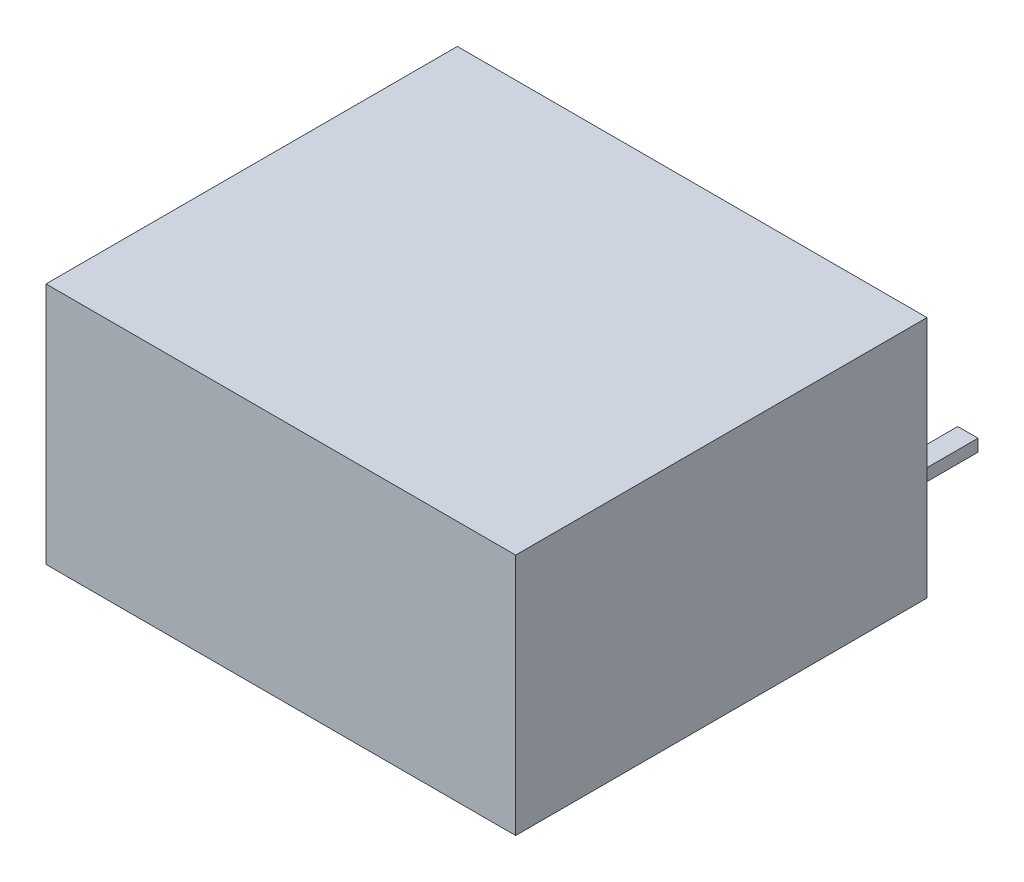
ISO-10303-21;
HEADER;
FILE_DESCRIPTION(('STEP AP214'),'2;1');
FILE_NAME('part.step','',(''),(''),'','','');
FILE_SCHEMA(('AUTOMOTIVE_DESIGN { 1 0 10303 214 1 1 1 1 }'));
ENDSEC;
DATA;
#1=APPLICATION_CONTEXT('core data for automotive mechanical design processes');
#2=APPLICATION_PROTOCOL_DEFINITION('international standard','automotive_design',2000,#1);
#3=PRODUCT_CONTEXT('',#1,'mechanical');
#4=PRODUCT('Part','Part','',(#3));
#5=PRODUCT_RELATED_PRODUCT_CATEGORY('part','',(#4));
#6=PRODUCT_DEFINITION_FORMATION('','',#4);
#7=PRODUCT_DEFINITION_CONTEXT('part definition',#1,'design');
#8=PRODUCT_DEFINITION('design','',#6,#7);
#9=PRODUCT_DEFINITION_SHAPE('','',#8);
#10=(LENGTH_UNIT() NAMED_UNIT(*) SI_UNIT(.MILLI.,.METRE.));
#11=(NAMED_UNIT(*) PLANE_ANGLE_UNIT() SI_UNIT($,.RADIAN.));
#12=(NAMED_UNIT(*) SI_UNIT($,.STERADIAN.) SOLID_ANGLE_UNIT());
#13=UNCERTAINTY_MEASURE_WITH_UNIT(LENGTH_MEASURE(1.E-05),#10,'distance_accuracy_value','');
#14=(GEOMETRIC_REPRESENTATION_CONTEXT(3) GLOBAL_UNCERTAINTY_ASSIGNED_CONTEXT((#13)) GLOBAL_UNIT_ASSIGNED_CONTEXT((#10,
#11,#12)) REPRESENTATION_CONTEXT('',''));
#15=CARTESIAN_POINT('',(0.,0.,0.));
#16=DIRECTION('',(0.,0.,1.));
#17=DIRECTION('',(1.,0.,0.));
#18=AXIS2_PLACEMENT_3D('',#15,#16,#17);
#19=CARTESIAN_POINT('',(1.02,-2.25,-3.));
#20=DIRECTION('',(1.,0.,0.));
#21=DIRECTION('',(0.,0.,-1.));
#22=AXIS2_PLACEMENT_3D('',#19,#20,#21);
#23=PLANE('',#22);
#24=DIRECTION('',(0.,1.,0.));
#25=VECTOR('',#24,1.);
#26=CARTESIAN_POINT('',(1.02,-2.25,0.));
#27=LINE('',#26,#25);
#28=CARTESIAN_POINT('',(1.02,-2.25,0.));
#29=VERTEX_POINT('',#28);
#30=CARTESIAN_POINT('',(1.02,-1.95,0.));
#31=VERTEX_POINT('',#30);
#32=EDGE_CURVE('E121',#29,#31,#27,.T.);
#33=ORIENTED_EDGE('',*,*,#32,.T.);
#34=DIRECTION('',(0.,0.,1.));
#35=VECTOR('',#34,1.);
#36=CARTESIAN_POINT('',(1.02,-1.95,-3.));
#37=LINE('',#36,#35);
#38=CARTESIAN_POINT('',(1.02,-1.95,-3.));
#39=VERTEX_POINT('',#38);
#40=EDGE_CURVE('E12',#39,#31,#37,.T.);
#41=ORIENTED_EDGE('',*,*,#40,.F.);
#42=DIRECTION('',(0.,1.,0.));
#43=VECTOR('',#42,1.);
#44=CARTESIAN_POINT('',(1.02,-2.25,-3.));
#45=LINE('',#44,#43);
#46=CARTESIAN_POINT('',(1.02,-2.25,-3.));
#47=VERTEX_POINT('',#46);
#48=EDGE_CURVE('E104',#47,#39,#45,.T.);
#49=ORIENTED_EDGE('',*,*,#48,.F.);
#50=DIRECTION('',(0.,0.,1.));
#51=VECTOR('',#50,1.);
#52=CARTESIAN_POINT('',(1.02,-2.25,-3.));
#53=LINE('',#52,#51);
#54=EDGE_CURVE('E117',#47,#29,#53,.T.);
#55=ORIENTED_EDGE('',*,*,#54,.T.);
#56=EDGE_LOOP('',(#33,#41,#49,#55));
#57=FACE_BOUND('',#56,.T.);
#58=ADVANCED_FACE('F52',(#57),#23,.F.);
#59=CARTESIAN_POINT('',(1.52,-1.95,-3.));
#60=DIRECTION('',(0.,-1.,0.));
#61=DIRECTION('',(0.,0.,-1.));
#62=AXIS2_PLACEMENT_3D('',#59,#60,#61);
#63=PLANE('',#62);
#64=DIRECTION('',(1.,0.,0.));
#65=VECTOR('',#64,1.);
#66=CARTESIAN_POINT('',(1.52,-1.95,0.));
#67=LINE('',#66,#65);
#68=CARTESIAN_POINT('',(1.52,-1.95,0.));
#69=VERTEX_POINT('',#68);
#70=EDGE_CURVE('E109',#31,#69,#67,.T.);
#71=ORIENTED_EDGE('',*,*,#70,.T.);
#72=DIRECTION('',(0.,0.,1.));
#73=VECTOR('',#72,1.);
#74=CARTESIAN_POINT('',(1.52,-1.95,-3.));
#75=LINE('',#74,#73);
#76=CARTESIAN_POINT('',(1.52,-1.95,-3.));
#77=VERTEX_POINT('',#76);
#78=EDGE_CURVE('E61',#77,#69,#75,.T.);
#79=ORIENTED_EDGE('',*,*,#78,.F.);
#80=DIRECTION('',(1.,0.,0.));
#81=VECTOR('',#80,1.);
#82=CARTESIAN_POINT('',(1.52,-1.95,-3.));
#83=LINE('',#82,#81);
#84=EDGE_CURVE('E99',#39,#77,#83,.T.);
#85=ORIENTED_EDGE('',*,*,#84,.F.);
#86=ORIENTED_EDGE('',*,*,#40,.T.);
#87=EDGE_LOOP('',(#71,#79,#85,#86));
#88=FACE_BOUND('',#87,.T.);
#89=ADVANCED_FACE('F108',(#88),#63,.F.);
#90=CARTESIAN_POINT('',(1.52,-2.25,-3.));
#91=DIRECTION('',(-1.,0.,0.));
#92=DIRECTION('',(0.,0.,1.));
#93=AXIS2_PLACEMENT_3D('',#90,#91,#92);
#94=PLANE('',#93);
#95=DIRECTION('',(0.,-1.,0.));
#96=VECTOR('',#95,1.);
#97=CARTESIAN_POINT('',(1.52,-2.25,0.));
#98=LINE('',#97,#96);
#99=CARTESIAN_POINT('',(1.52,-2.25,0.));
#100=VERTEX_POINT('',#99);
#101=EDGE_CURVE('E86',#69,#100,#98,.T.);
#102=ORIENTED_EDGE('',*,*,#101,.T.);
#103=DIRECTION('',(0.,0.,1.));
#104=VECTOR('',#103,1.);
#105=CARTESIAN_POINT('',(1.52,-2.25,-3.));
#106=LINE('',#105,#104);
#107=CARTESIAN_POINT('',(1.52,-2.25,-3.));
#108=VERTEX_POINT('',#107);
#109=EDGE_CURVE('E111',#108,#100,#106,.T.);
#110=ORIENTED_EDGE('',*,*,#109,.F.);
#111=DIRECTION('',(0.,-1.,0.));
#112=VECTOR('',#111,1.);
#113=CARTESIAN_POINT('',(1.52,-2.25,-3.));
#114=LINE('',#113,#112);
#115=EDGE_CURVE('E102',#77,#108,#114,.T.);
#116=ORIENTED_EDGE('',*,*,#115,.F.);
#117=ORIENTED_EDGE('',*,*,#78,.T.);
#118=EDGE_LOOP('',(#102,#110,#116,#117));
#119=FACE_BOUND('',#118,.T.);
#120=ADVANCED_FACE('F112',(#119),#94,.F.);
#121=CARTESIAN_POINT('',(1.52,-2.25,-3.));
#122=DIRECTION('',(0.,1.,0.));
#123=DIRECTION('',(0.,0.,1.));
#124=AXIS2_PLACEMENT_3D('',#121,#122,#123);
#125=PLANE('',#124);
#126=DIRECTION('',(-1.,0.,0.));
#127=VECTOR('',#126,1.);
#128=CARTESIAN_POINT('',(1.52,-2.25,0.));
#129=LINE('',#128,#127);
#130=EDGE_CURVE('E92',#100,#29,#129,.T.);
#131=ORIENTED_EDGE('',*,*,#130,.T.);
#132=ORIENTED_EDGE('',*,*,#54,.F.);
#133=DIRECTION('',(-1.,0.,0.));
#134=VECTOR('',#133,1.);
#135=CARTESIAN_POINT('',(1.52,-2.25,-3.));
#136=LINE('',#135,#134);
#137=EDGE_CURVE('E69',#108,#47,#136,.T.);
#138=ORIENTED_EDGE('',*,*,#137,.F.);
#139=ORIENTED_EDGE('',*,*,#109,.T.);
#140=EDGE_LOOP('',(#131,#132,#138,#139));
#141=FACE_BOUND('',#140,.T.);
#142=ADVANCED_FACE('F133',(#141),#125,.F.);
#143=CARTESIAN_POINT('',(2.54,0.,-3.));
#144=DIRECTION('',(0.,0.,1.));
#145=DIRECTION('',(1.,0.,0.));
#146=AXIS2_PLACEMENT_3D('',#143,#144,#145);
#147=PLANE('',#146);
#148=ORIENTED_EDGE('',*,*,#48,.T.);
#149=ORIENTED_EDGE('',*,*,#84,.T.);
#150=ORIENTED_EDGE('',*,*,#115,.T.);
#151=ORIENTED_EDGE('',*,*,#137,.T.);
#152=EDGE_LOOP('',(#148,#149,#150,#151));
#153=FACE_BOUND('',#152,.T.);
#154=ADVANCED_FACE('F100',(#153),#147,.F.);
#155=CARTESIAN_POINT('',(2.54,0.,0.));
#156=DIRECTION('',(0.,0.,1.));
#157=DIRECTION('',(1.,0.,0.));
#158=AXIS2_PLACEMENT_3D('',#155,#156,#157);
#159=PLANE('',#158);
#160=ORIENTED_EDGE('',*,*,#32,.F.);
#161=ORIENTED_EDGE('',*,*,#130,.F.);
#162=ORIENTED_EDGE('',*,*,#101,.F.);
#163=ORIENTED_EDGE('',*,*,#70,.F.);
#164=EDGE_LOOP('',(#160,#161,#162,#163));
#165=FACE_BOUND('',#164,.T.);
#166=ADVANCED_FACE('F136',(#165),#159,.T.);
#167=CLOSED_SHELL('',(#58,#89,#120,#142,#154,#166));
#168=MANIFOLD_SOLID_BREP('B2',#167);
#169=CARTESIAN_POINT('',(3.56,-2.25,-3.));
#170=DIRECTION('',(1.,0.,0.));
#171=DIRECTION('',(0.,0.,-1.));
#172=AXIS2_PLACEMENT_3D('',#169,#170,#171);
#173=PLANE('',#172);
#174=DIRECTION('',(0.,1.,0.));
#175=VECTOR('',#174,1.);
#176=CARTESIAN_POINT('',(3.56,-2.25,0.));
#177=LINE('',#176,#175);
#178=CARTESIAN_POINT('',(3.56,-2.25,0.));
#179=VERTEX_POINT('',#178);
#180=CARTESIAN_POINT('',(3.56,-1.95,0.));
#181=VERTEX_POINT('',#180);
#182=EDGE_CURVE('E273',#179,#181,#177,.T.);
#183=ORIENTED_EDGE('',*,*,#182,.T.);
#184=DIRECTION('',(0.,0.,1.));
#185=VECTOR('',#184,1.);
#186=CARTESIAN_POINT('',(3.56,-1.95,-3.));
#187=LINE('',#186,#185);
#188=CARTESIAN_POINT('',(3.56,-1.95,-3.));
#189=VERTEX_POINT('',#188);
#190=EDGE_CURVE('E50',#189,#181,#187,.T.);
#191=ORIENTED_EDGE('',*,*,#190,.F.);
#192=DIRECTION('',(0.,1.,0.));
#193=VECTOR('',#192,1.);
#194=CARTESIAN_POINT('',(3.56,-2.25,-3.));
#195=LINE('',#194,#193);
#196=CARTESIAN_POINT('',(3.56,-2.25,-3.));
#197=VERTEX_POINT('',#196);
#198=EDGE_CURVE('E256',#197,#189,#195,.T.);
#199=ORIENTED_EDGE('',*,*,#198,.F.);
#200=DIRECTION('',(0.,0.,1.));
#201=VECTOR('',#200,1.);
#202=CARTESIAN_POINT('',(3.56,-2.25,-3.));
#203=LINE('',#202,#201);
#204=EDGE_CURVE('E269',#197,#179,#203,.T.);
#205=ORIENTED_EDGE('',*,*,#204,.T.);
#206=EDGE_LOOP('',(#183,#191,#199,#205));
#207=FACE_BOUND('',#206,.T.);
#208=ADVANCED_FACE('F204',(#207),#173,.F.);
#209=CARTESIAN_POINT('',(4.06,-1.95,-3.));
#210=DIRECTION('',(0.,-1.,0.));
#211=DIRECTION('',(0.,0.,-1.));
#212=AXIS2_PLACEMENT_3D('',#209,#210,#211);
#213=PLANE('',#212);
#214=DIRECTION('',(1.,0.,0.));
#215=VECTOR('',#214,1.);
#216=CARTESIAN_POINT('',(4.06,-1.95,0.));
#217=LINE('',#216,#215);
#218=CARTESIAN_POINT('',(4.06,-1.95,0.));
#219=VERTEX_POINT('',#218);
#220=EDGE_CURVE('E261',#181,#219,#217,.T.);
#221=ORIENTED_EDGE('',*,*,#220,.T.);
#222=DIRECTION('',(0.,0.,1.));
#223=VECTOR('',#222,1.);
#224=CARTESIAN_POINT('',(4.06,-1.95,-3.));
#225=LINE('',#224,#223);
#226=CARTESIAN_POINT('',(4.06,-1.95,-3.));
#227=VERTEX_POINT('',#226);
#228=EDGE_CURVE('E213',#227,#219,#225,.T.);
#229=ORIENTED_EDGE('',*,*,#228,.F.);
#230=DIRECTION('',(1.,0.,0.));
#231=VECTOR('',#230,1.);
#232=CARTESIAN_POINT('',(4.06,-1.95,-3.));
#233=LINE('',#232,#231);
#234=EDGE_CURVE('E251',#189,#227,#233,.T.);
#235=ORIENTED_EDGE('',*,*,#234,.F.);
#236=ORIENTED_EDGE('',*,*,#190,.T.);
#237=EDGE_LOOP('',(#221,#229,#235,#236));
#238=FACE_BOUND('',#237,.T.);
#239=ADVANCED_FACE('F260',(#238),#213,.F.);
#240=CARTESIAN_POINT('',(4.06,-2.25,-3.));
#241=DIRECTION('',(-1.,0.,0.));
#242=DIRECTION('',(0.,0.,1.));
#243=AXIS2_PLACEMENT_3D('',#240,#241,#242);
#244=PLANE('',#243);
#245=DIRECTION('',(0.,-1.,0.));
#246=VECTOR('',#245,1.);
#247=CARTESIAN_POINT('',(4.06,-2.25,0.));
#248=LINE('',#247,#246);
#249=CARTESIAN_POINT('',(4.06,-2.25,0.));
#250=VERTEX_POINT('',#249);
#251=EDGE_CURVE('E238',#219,#250,#248,.T.);
#252=ORIENTED_EDGE('',*,*,#251,.T.);
#253=DIRECTION('',(0.,0.,1.));
#254=VECTOR('',#253,1.);
#255=CARTESIAN_POINT('',(4.06,-2.25,-3.));
#256=LINE('',#255,#254);
#257=CARTESIAN_POINT('',(4.06,-2.25,-3.));
#258=VERTEX_POINT('',#257);
#259=EDGE_CURVE('E263',#258,#250,#256,.T.);
#260=ORIENTED_EDGE('',*,*,#259,.F.);
#261=DIRECTION('',(0.,-1.,0.));
#262=VECTOR('',#261,1.);
#263=CARTESIAN_POINT('',(4.06,-2.25,-3.));
#264=LINE('',#263,#262);
#265=EDGE_CURVE('E254',#227,#258,#264,.T.);
#266=ORIENTED_EDGE('',*,*,#265,.F.);
#267=ORIENTED_EDGE('',*,*,#228,.T.);
#268=EDGE_LOOP('',(#252,#260,#266,#267));
#269=FACE_BOUND('',#268,.T.);
#270=ADVANCED_FACE('F264',(#269),#244,.F.);
#271=CARTESIAN_POINT('',(4.06,-2.25,-3.));
#272=DIRECTION('',(0.,1.,0.));
#273=DIRECTION('',(0.,0.,1.));
#274=AXIS2_PLACEMENT_3D('',#271,#272,#273);
#275=PLANE('',#274);
#276=DIRECTION('',(-1.,0.,0.));
#277=VECTOR('',#276,1.);
#278=CARTESIAN_POINT('',(4.06,-2.25,0.));
#279=LINE('',#278,#277);
#280=EDGE_CURVE('E244',#250,#179,#279,.T.);
#281=ORIENTED_EDGE('',*,*,#280,.T.);
#282=ORIENTED_EDGE('',*,*,#204,.F.);
#283=DIRECTION('',(-1.,0.,0.));
#284=VECTOR('',#283,1.);
#285=CARTESIAN_POINT('',(4.06,-2.25,-3.));
#286=LINE('',#285,#284);
#287=EDGE_CURVE('E221',#258,#197,#286,.T.);
#288=ORIENTED_EDGE('',*,*,#287,.F.);
#289=ORIENTED_EDGE('',*,*,#259,.T.);
#290=EDGE_LOOP('',(#281,#282,#288,#289));
#291=FACE_BOUND('',#290,.T.);
#292=ADVANCED_FACE('F285',(#291),#275,.F.);
#293=CARTESIAN_POINT('',(5.08,0.,-3.));
#294=DIRECTION('',(0.,0.,1.));
#295=DIRECTION('',(1.,0.,0.));
#296=AXIS2_PLACEMENT_3D('',#293,#294,#295);
#297=PLANE('',#296);
#298=ORIENTED_EDGE('',*,*,#198,.T.);
#299=ORIENTED_EDGE('',*,*,#234,.T.);
#300=ORIENTED_EDGE('',*,*,#265,.T.);
#301=ORIENTED_EDGE('',*,*,#287,.T.);
#302=EDGE_LOOP('',(#298,#299,#300,#301));
#303=FACE_BOUND('',#302,.T.);
#304=ADVANCED_FACE('F252',(#303),#297,.F.);
#305=CARTESIAN_POINT('',(5.08,0.,0.));
#306=DIRECTION('',(0.,0.,1.));
#307=DIRECTION('',(1.,0.,0.));
#308=AXIS2_PLACEMENT_3D('',#305,#306,#307);
#309=PLANE('',#308);
#310=ORIENTED_EDGE('',*,*,#182,.F.);
#311=ORIENTED_EDGE('',*,*,#280,.F.);
#312=ORIENTED_EDGE('',*,*,#251,.F.);
#313=ORIENTED_EDGE('',*,*,#220,.F.);
#314=EDGE_LOOP('',(#310,#311,#312,#313));
#315=FACE_BOUND('',#314,.T.);
#316=ADVANCED_FACE('F288',(#315),#309,.T.);
#317=CLOSED_SHELL('',(#208,#239,#270,#292,#304,#316));
#318=MANIFOLD_SOLID_BREP('B6',#317);
#319=CARTESIAN_POINT('',(-1.52,-2.25,-3.));
#320=DIRECTION('',(1.,0.,0.));
#321=DIRECTION('',(0.,0.,-1.));
#322=AXIS2_PLACEMENT_3D('',#319,#320,#321);
#323=PLANE('',#322);
#324=DIRECTION('',(0.,1.,0.));
#325=VECTOR('',#324,1.);
#326=CARTESIAN_POINT('',(-1.52,-2.25,0.));
#327=LINE('',#326,#325);
#328=CARTESIAN_POINT('',(-1.52,-2.25,0.));
#329=VERTEX_POINT('',#328);
#330=CARTESIAN_POINT('',(-1.52,-1.95,0.));
#331=VERTEX_POINT('',#330);
#332=EDGE_CURVE('E425',#329,#331,#327,.T.);
#333=ORIENTED_EDGE('',*,*,#332,.T.);
#334=DIRECTION('',(0.,0.,1.));
#335=VECTOR('',#334,1.);
#336=CARTESIAN_POINT('',(-1.52,-1.95,-3.));
#337=LINE('',#336,#335);
#338=CARTESIAN_POINT('',(-1.52,-1.95,-3.));
#339=VERTEX_POINT('',#338);
#340=EDGE_CURVE('E202',#339,#331,#337,.T.);
#341=ORIENTED_EDGE('',*,*,#340,.F.);
#342=DIRECTION('',(0.,1.,0.));
#343=VECTOR('',#342,1.);
#344=CARTESIAN_POINT('',(-1.52,-2.25,-3.));
#345=LINE('',#344,#343);
#346=CARTESIAN_POINT('',(-1.52,-2.25,-3.));
#347=VERTEX_POINT('',#346);
#348=EDGE_CURVE('E408',#347,#339,#345,.T.);
#349=ORIENTED_EDGE('',*,*,#348,.F.);
#350=DIRECTION('',(0.,0.,1.));
#351=VECTOR('',#350,1.);
#352=CARTESIAN_POINT('',(-1.52,-2.25,-3.));
#353=LINE('',#352,#351);
#354=EDGE_CURVE('E421',#347,#329,#353,.T.);
#355=ORIENTED_EDGE('',*,*,#354,.T.);
#356=EDGE_LOOP('',(#333,#341,#349,#355));
#357=FACE_BOUND('',#356,.T.);
#358=ADVANCED_FACE('F356',(#357),#323,.F.);
#359=CARTESIAN_POINT('',(-1.02,-1.95,-3.));
#360=DIRECTION('',(0.,-1.,0.));
#361=DIRECTION('',(0.,0.,-1.));
#362=AXIS2_PLACEMENT_3D('',#359,#360,#361);
#363=PLANE('',#362);
#364=DIRECTION('',(1.,0.,0.));
#365=VECTOR('',#364,1.);
#366=CARTESIAN_POINT('',(-1.02,-1.95,0.));
#367=LINE('',#366,#365);
#368=CARTESIAN_POINT('',(-1.02,-1.95,0.));
#369=VERTEX_POINT('',#368);
#370=EDGE_CURVE('E413',#331,#369,#367,.T.);
#371=ORIENTED_EDGE('',*,*,#370,.T.);
#372=DIRECTION('',(0.,0.,1.));
#373=VECTOR('',#372,1.);
#374=CARTESIAN_POINT('',(-1.02,-1.95,-3.));
#375=LINE('',#374,#373);
#376=CARTESIAN_POINT('',(-1.02,-1.95,-3.));
#377=VERTEX_POINT('',#376);
#378=EDGE_CURVE('E365',#377,#369,#375,.T.);
#379=ORIENTED_EDGE('',*,*,#378,.F.);
#380=DIRECTION('',(1.,0.,0.));
#381=VECTOR('',#380,1.);
#382=CARTESIAN_POINT('',(-1.02,-1.95,-3.));
#383=LINE('',#382,#381);
#384=EDGE_CURVE('E403',#339,#377,#383,.T.);
#385=ORIENTED_EDGE('',*,*,#384,.F.);
#386=ORIENTED_EDGE('',*,*,#340,.T.);
#387=EDGE_LOOP('',(#371,#379,#385,#386));
#388=FACE_BOUND('',#387,.T.);
#389=ADVANCED_FACE('F412',(#388),#363,.F.);
#390=CARTESIAN_POINT('',(-1.02,-2.25,-3.));
#391=DIRECTION('',(-1.,0.,0.));
#392=DIRECTION('',(0.,0.,1.));
#393=AXIS2_PLACEMENT_3D('',#390,#391,#392);
#394=PLANE('',#393);
#395=DIRECTION('',(0.,-1.,0.));
#396=VECTOR('',#395,1.);
#397=CARTESIAN_POINT('',(-1.02,-2.25,0.));
#398=LINE('',#397,#396);
#399=CARTESIAN_POINT('',(-1.02,-2.25,0.));
#400=VERTEX_POINT('',#399);
#401=EDGE_CURVE('E390',#369,#400,#398,.T.);
#402=ORIENTED_EDGE('',*,*,#401,.T.);
#403=DIRECTION('',(0.,0.,1.));
#404=VECTOR('',#403,1.);
#405=CARTESIAN_POINT('',(-1.02,-2.25,-3.));
#406=LINE('',#405,#404);
#407=CARTESIAN_POINT('',(-1.02,-2.25,-3.));
#408=VERTEX_POINT('',#407);
#409=EDGE_CURVE('E415',#408,#400,#406,.T.);
#410=ORIENTED_EDGE('',*,*,#409,.F.);
#411=DIRECTION('',(0.,-1.,0.));
#412=VECTOR('',#411,1.);
#413=CARTESIAN_POINT('',(-1.02,-2.25,-3.));
#414=LINE('',#413,#412);
#415=EDGE_CURVE('E406',#377,#408,#414,.T.);
#416=ORIENTED_EDGE('',*,*,#415,.F.);
#417=ORIENTED_EDGE('',*,*,#378,.T.);
#418=EDGE_LOOP('',(#402,#410,#416,#417));
#419=FACE_BOUND('',#418,.T.);
#420=ADVANCED_FACE('F416',(#419),#394,.F.);
#421=CARTESIAN_POINT('',(-1.02,-2.25,-3.));
#422=DIRECTION('',(0.,1.,0.));
#423=DIRECTION('',(0.,0.,1.));
#424=AXIS2_PLACEMENT_3D('',#421,#422,#423);
#425=PLANE('',#424);
#426=DIRECTION('',(-1.,0.,0.));
#427=VECTOR('',#426,1.);
#428=CARTESIAN_POINT('',(-1.02,-2.25,0.));
#429=LINE('',#428,#427);
#430=EDGE_CURVE('E396',#400,#329,#429,.T.);
#431=ORIENTED_EDGE('',*,*,#430,.T.);
#432=ORIENTED_EDGE('',*,*,#354,.F.);
#433=DIRECTION('',(-1.,0.,0.));
#434=VECTOR('',#433,1.);
#435=CARTESIAN_POINT('',(-1.02,-2.25,-3.));
#436=LINE('',#435,#434);
#437=EDGE_CURVE('E373',#408,#347,#436,.T.);
#438=ORIENTED_EDGE('',*,*,#437,.F.);
#439=ORIENTED_EDGE('',*,*,#409,.T.);
#440=EDGE_LOOP('',(#431,#432,#438,#439));
#441=FACE_BOUND('',#440,.T.);
#442=ADVANCED_FACE('F437',(#441),#425,.F.);
#443=CARTESIAN_POINT('',(0.,0.,-3.));
#444=DIRECTION('',(0.,0.,1.));
#445=DIRECTION('',(1.,0.,0.));
#446=AXIS2_PLACEMENT_3D('',#443,#444,#445);
#447=PLANE('',#446);
#448=ORIENTED_EDGE('',*,*,#348,.T.);
#449=ORIENTED_EDGE('',*,*,#384,.T.);
#450=ORIENTED_EDGE('',*,*,#415,.T.);
#451=ORIENTED_EDGE('',*,*,#437,.T.);
#452=EDGE_LOOP('',(#448,#449,#450,#451));
#453=FACE_BOUND('',#452,.T.);
#454=ADVANCED_FACE('F404',(#453),#447,.F.);
#455=CARTESIAN_POINT('',(0.,0.,0.));
#456=DIRECTION('',(0.,0.,1.));
#457=DIRECTION('',(1.,0.,0.));
#458=AXIS2_PLACEMENT_3D('',#455,#456,#457);
#459=PLANE('',#458);
#460=ORIENTED_EDGE('',*,*,#332,.F.);
#461=ORIENTED_EDGE('',*,*,#430,.F.);
#462=ORIENTED_EDGE('',*,*,#401,.F.);
#463=ORIENTED_EDGE('',*,*,#370,.F.);
#464=EDGE_LOOP('',(#460,#461,#462,#463));
#465=FACE_BOUND('',#464,.T.);
#466=ADVANCED_FACE('F440',(#465),#459,.T.);
#467=CLOSED_SHELL('',(#358,#389,#420,#442,#454,#466));
#468=MANIFOLD_SOLID_BREP('B44',#467);
#469=CARTESIAN_POINT('',(1.02,-2.25,-3.));
#470=DIRECTION('',(1.,0.,0.));
#471=DIRECTION('',(0.,0.,-1.));
#472=AXIS2_PLACEMENT_3D('',#469,#470,#471);
#473=PLANE('',#472);
#474=DIRECTION('',(0.,1.,0.));
#475=VECTOR('',#474,1.);
#476=CARTESIAN_POINT('',(1.02,-2.25,0.));
#477=LINE('',#476,#475);
#478=CARTESIAN_POINT('',(1.02,-2.25,0.));
#479=VERTEX_POINT('',#478);
#480=CARTESIAN_POINT('',(1.02,-1.95,0.));
#481=VERTEX_POINT('',#480);
#482=EDGE_CURVE('E578',#479,#481,#477,.T.);
#483=ORIENTED_EDGE('',*,*,#482,.T.);
#484=DIRECTION('',(0.,0.,1.));
#485=VECTOR('',#484,1.);
#486=CARTESIAN_POINT('',(1.02,-1.95,-3.));
#487=LINE('',#486,#485);
#488=CARTESIAN_POINT('',(1.02,-1.95,-3.));
#489=VERTEX_POINT('',#488);
#490=EDGE_CURVE('E354',#489,#481,#487,.T.);
#491=ORIENTED_EDGE('',*,*,#490,.F.);
#492=DIRECTION('',(0.,1.,0.));
#493=VECTOR('',#492,1.);
#494=CARTESIAN_POINT('',(1.02,-2.25,-3.));
#495=LINE('',#494,#493);
#496=CARTESIAN_POINT('',(1.02,-2.25,-3.));
#497=VERTEX_POINT('',#496);
#498=EDGE_CURVE('E560',#497,#489,#495,.T.);
#499=ORIENTED_EDGE('',*,*,#498,.F.);
#500=DIRECTION('',(0.,0.,1.));
#501=VECTOR('',#500,1.);
#502=CARTESIAN_POINT('',(1.02,-2.25,-3.));
#503=LINE('',#502,#501);
#504=EDGE_CURVE('E574',#497,#479,#503,.T.);
#505=ORIENTED_EDGE('',*,*,#504,.T.);
#506=EDGE_LOOP('',(#483,#491,#499,#505));
#507=FACE_BOUND('',#506,.T.);
#508=ADVANCED_FACE('F508',(#507),#473,.F.);
#509=CARTESIAN_POINT('',(1.52,-1.95,-3.));
#510=DIRECTION('',(0.,-1.,0.));
#511=DIRECTION('',(0.,0.,-1.));
#512=AXIS2_PLACEMENT_3D('',#509,#510,#511);
#513=PLANE('',#512);
#514=DIRECTION('',(1.,0.,0.));
#515=VECTOR('',#514,1.);
#516=CARTESIAN_POINT('',(1.52,-1.95,0.));
#517=LINE('',#516,#515);
#518=CARTESIAN_POINT('',(1.52,-1.95,0.));
#519=VERTEX_POINT('',#518);
#520=EDGE_CURVE('E565',#481,#519,#517,.T.);
#521=ORIENTED_EDGE('',*,*,#520,.T.);
#522=DIRECTION('',(0.,0.,1.));
#523=VECTOR('',#522,1.);
#524=CARTESIAN_POINT('',(1.52,-1.95,-3.));
#525=LINE('',#524,#523);
#526=CARTESIAN_POINT('',(1.52,-1.95,-3.));
#527=VERTEX_POINT('',#526);
#528=EDGE_CURVE('E517',#527,#519,#525,.T.);
#529=ORIENTED_EDGE('',*,*,#528,.F.);
#530=DIRECTION('',(1.,0.,0.));
#531=VECTOR('',#530,1.);
#532=CARTESIAN_POINT('',(1.52,-1.95,-3.));
#533=LINE('',#532,#531);
#534=EDGE_CURVE('E555',#489,#527,#533,.T.);
#535=ORIENTED_EDGE('',*,*,#534,.F.);
#536=ORIENTED_EDGE('',*,*,#490,.T.);
#537=EDGE_LOOP('',(#521,#529,#535,#536));
#538=FACE_BOUND('',#537,.T.);
#539=ADVANCED_FACE('F564',(#538),#513,.F.);
#540=CARTESIAN_POINT('',(1.52,-2.25,-3.));
#541=DIRECTION('',(-1.,0.,0.));
#542=DIRECTION('',(0.,0.,1.));
#543=AXIS2_PLACEMENT_3D('',#540,#541,#542);
#544=PLANE('',#543);
#545=DIRECTION('',(0.,-1.,0.));
#546=VECTOR('',#545,1.);
#547=CARTESIAN_POINT('',(1.52,-2.25,0.));
#548=LINE('',#547,#546);
#549=CARTESIAN_POINT('',(1.52,-2.25,0.));
#550=VERTEX_POINT('',#549);
#551=EDGE_CURVE('E542',#519,#550,#548,.T.);
#552=ORIENTED_EDGE('',*,*,#551,.T.);
#553=DIRECTION('',(0.,0.,1.));
#554=VECTOR('',#553,1.);
#555=CARTESIAN_POINT('',(1.52,-2.25,-3.));
#556=LINE('',#555,#554);
#557=CARTESIAN_POINT('',(1.52,-2.25,-3.));
#558=VERTEX_POINT('',#557);
#559=EDGE_CURVE('E567',#558,#550,#556,.T.);
#560=ORIENTED_EDGE('',*,*,#559,.F.);
#561=DIRECTION('',(0.,-1.,0.));
#562=VECTOR('',#561,1.);
#563=CARTESIAN_POINT('',(1.52,-2.25,-3.));
#564=LINE('',#563,#562);
#565=EDGE_CURVE('E558',#527,#558,#564,.T.);
#566=ORIENTED_EDGE('',*,*,#565,.F.);
#567=ORIENTED_EDGE('',*,*,#528,.T.);
#568=EDGE_LOOP('',(#552,#560,#566,#567));
#569=FACE_BOUND('',#568,.T.);
#570=ADVANCED_FACE('F568',(#569),#544,.F.);
#571=CARTESIAN_POINT('',(1.52,-2.25,-3.));
#572=DIRECTION('',(0.,1.,0.));
#573=DIRECTION('',(0.,0.,1.));
#574=AXIS2_PLACEMENT_3D('',#571,#572,#573);
#575=PLANE('',#574);
#576=DIRECTION('',(-1.,0.,0.));
#577=VECTOR('',#576,1.);
#578=CARTESIAN_POINT('',(1.52,-2.25,0.));
#579=LINE('',#578,#577);
#580=EDGE_CURVE('E548',#550,#479,#579,.T.);
#581=ORIENTED_EDGE('',*,*,#580,.T.);
#582=ORIENTED_EDGE('',*,*,#504,.F.);
#583=DIRECTION('',(-1.,0.,0.));
#584=VECTOR('',#583,1.);
#585=CARTESIAN_POINT('',(1.52,-2.25,-3.));
#586=LINE('',#585,#584);
#587=EDGE_CURVE('E525',#558,#497,#586,.T.);
#588=ORIENTED_EDGE('',*,*,#587,.F.);
#589=ORIENTED_EDGE('',*,*,#559,.T.);
#590=EDGE_LOOP('',(#581,#582,#588,#589));
#591=FACE_BOUND('',#590,.T.);
#592=ADVANCED_FACE('F589',(#591),#575,.F.);
#593=CARTESIAN_POINT('',(2.54,0.,-3.));
#594=DIRECTION('',(0.,0.,1.));
#595=DIRECTION('',(1.,0.,0.));
#596=AXIS2_PLACEMENT_3D('',#593,#594,#595);
#597=PLANE('',#596);
#598=ORIENTED_EDGE('',*,*,#498,.T.);
#599=ORIENTED_EDGE('',*,*,#534,.T.);
#600=ORIENTED_EDGE('',*,*,#565,.T.);
#601=ORIENTED_EDGE('',*,*,#587,.T.);
#602=EDGE_LOOP('',(#598,#599,#600,#601));
#603=FACE_BOUND('',#602,.T.);
#604=ADVANCED_FACE('F556',(#603),#597,.F.);
#605=CARTESIAN_POINT('',(2.54,0.,0.));
#606=DIRECTION('',(0.,0.,1.));
#607=DIRECTION('',(1.,0.,0.));
#608=AXIS2_PLACEMENT_3D('',#605,#606,#607);
#609=PLANE('',#608);
#610=ORIENTED_EDGE('',*,*,#482,.F.);
#611=ORIENTED_EDGE('',*,*,#580,.F.);
#612=ORIENTED_EDGE('',*,*,#551,.F.);
#613=ORIENTED_EDGE('',*,*,#520,.F.);
#614=EDGE_LOOP('',(#610,#611,#612,#613));
#615=FACE_BOUND('',#614,.T.);
#616=ADVANCED_FACE('F592',(#615),#609,.T.);
#617=CLOSED_SHELL('',(#508,#539,#570,#592,#604,#616));
#618=MANIFOLD_SOLID_BREP('B196',#617);
#619=CARTESIAN_POINT('',(-4.06,-2.25,-3.));
#620=DIRECTION('',(1.,0.,0.));
#621=DIRECTION('',(0.,0.,-1.));
#622=AXIS2_PLACEMENT_3D('',#619,#620,#621);
#623=PLANE('',#622);
#624=DIRECTION('',(0.,1.,0.));
#625=VECTOR('',#624,1.);
#626=CARTESIAN_POINT('',(-4.06,-2.25,0.));
#627=LINE('',#626,#625);
#628=CARTESIAN_POINT('',(-4.06,-2.25,0.));
#629=VERTEX_POINT('',#628);
#630=CARTESIAN_POINT('',(-4.06,-1.95,0.));
#631=VERTEX_POINT('',#630);
#632=EDGE_CURVE('E729',#629,#631,#627,.T.);
#633=ORIENTED_EDGE('',*,*,#632,.T.);
#634=DIRECTION('',(0.,0.,1.));
#635=VECTOR('',#634,1.);
#636=CARTESIAN_POINT('',(-4.06,-1.95,-3.));
#637=LINE('',#636,#635);
#638=CARTESIAN_POINT('',(-4.06,-1.95,-3.));
#639=VERTEX_POINT('',#638);
#640=EDGE_CURVE('E506',#639,#631,#637,.T.);
#641=ORIENTED_EDGE('',*,*,#640,.F.);
#642=DIRECTION('',(0.,1.,0.));
#643=VECTOR('',#642,1.);
#644=CARTESIAN_POINT('',(-4.06,-2.25,-3.));
#645=LINE('',#644,#643);
#646=CARTESIAN_POINT('',(-4.06,-2.25,-3.));
#647=VERTEX_POINT('',#646);
#648=EDGE_CURVE('E712',#647,#639,#645,.T.);
#649=ORIENTED_EDGE('',*,*,#648,.F.);
#650=DIRECTION('',(0.,0.,1.));
#651=VECTOR('',#650,1.);
#652=CARTESIAN_POINT('',(-4.06,-2.25,-3.));
#653=LINE('',#652,#651);
#654=EDGE_CURVE('E725',#647,#629,#653,.T.);
#655=ORIENTED_EDGE('',*,*,#654,.T.);
#656=EDGE_LOOP('',(#633,#641,#649,#655));
#657=FACE_BOUND('',#656,.T.);
#658=ADVANCED_FACE('F660',(#657),#623,.F.);
#659=CARTESIAN_POINT('',(-3.56,-1.95,-3.));
#660=DIRECTION('',(0.,-1.,0.));
#661=DIRECTION('',(0.,0.,-1.));
#662=AXIS2_PLACEMENT_3D('',#659,#660,#661);
#663=PLANE('',#662);
#664=DIRECTION('',(1.,0.,0.));
#665=VECTOR('',#664,1.);
#666=CARTESIAN_POINT('',(-3.56,-1.95,0.));
#667=LINE('',#666,#665);
#668=CARTESIAN_POINT('',(-3.56,-1.95,0.));
#669=VERTEX_POINT('',#668);
#670=EDGE_CURVE('E717',#631,#669,#667,.T.);
#671=ORIENTED_EDGE('',*,*,#670,.T.);
#672=DIRECTION('',(0.,0.,1.));
#673=VECTOR('',#672,1.);
#674=CARTESIAN_POINT('',(-3.56,-1.95,-3.));
#675=LINE('',#674,#673);
#676=CARTESIAN_POINT('',(-3.56,-1.95,-3.));
#677=VERTEX_POINT('',#676);
#678=EDGE_CURVE('E669',#677,#669,#675,.T.);
#679=ORIENTED_EDGE('',*,*,#678,.F.);
#680=DIRECTION('',(1.,0.,0.));
#681=VECTOR('',#680,1.);
#682=CARTESIAN_POINT('',(-3.56,-1.95,-3.));
#683=LINE('',#682,#681);
#684=EDGE_CURVE('E707',#639,#677,#683,.T.);
#685=ORIENTED_EDGE('',*,*,#684,.F.);
#686=ORIENTED_EDGE('',*,*,#640,.T.);
#687=EDGE_LOOP('',(#671,#679,#685,#686));
#688=FACE_BOUND('',#687,.T.);
#689=ADVANCED_FACE('F716',(#688),#663,.F.);
#690=CARTESIAN_POINT('',(-3.56,-2.25,-3.));
#691=DIRECTION('',(-1.,0.,0.));
#692=DIRECTION('',(0.,0.,1.));
#693=AXIS2_PLACEMENT_3D('',#690,#691,#692);
#694=PLANE('',#693);
#695=DIRECTION('',(0.,-1.,0.));
#696=VECTOR('',#695,1.);
#697=CARTESIAN_POINT('',(-3.56,-2.25,0.));
#698=LINE('',#697,#696);
#699=CARTESIAN_POINT('',(-3.56,-2.25,0.));
#700=VERTEX_POINT('',#699);
#701=EDGE_CURVE('E694',#669,#700,#698,.T.);
#702=ORIENTED_EDGE('',*,*,#701,.T.);
#703=DIRECTION('',(0.,0.,1.));
#704=VECTOR('',#703,1.);
#705=CARTESIAN_POINT('',(-3.56,-2.25,-3.));
#706=LINE('',#705,#704);
#707=CARTESIAN_POINT('',(-3.56,-2.25,-3.));
#708=VERTEX_POINT('',#707);
#709=EDGE_CURVE('E719',#708,#700,#706,.T.);
#710=ORIENTED_EDGE('',*,*,#709,.F.);
#711=DIRECTION('',(0.,-1.,0.));
#712=VECTOR('',#711,1.);
#713=CARTESIAN_POINT('',(-3.56,-2.25,-3.));
#714=LINE('',#713,#712);
#715=EDGE_CURVE('E710',#677,#708,#714,.T.);
#716=ORIENTED_EDGE('',*,*,#715,.F.);
#717=ORIENTED_EDGE('',*,*,#678,.T.);
#718=EDGE_LOOP('',(#702,#710,#716,#717));
#719=FACE_BOUND('',#718,.T.);
#720=ADVANCED_FACE('F720',(#719),#694,.F.);
#721=CARTESIAN_POINT('',(-3.56,-2.25,-3.));
#722=DIRECTION('',(0.,1.,0.));
#723=DIRECTION('',(0.,0.,1.));
#724=AXIS2_PLACEMENT_3D('',#721,#722,#723);
#725=PLANE('',#724);
#726=DIRECTION('',(-1.,0.,0.));
#727=VECTOR('',#726,1.);
#728=CARTESIAN_POINT('',(-3.56,-2.25,0.));
#729=LINE('',#728,#727);
#730=EDGE_CURVE('E700',#700,#629,#729,.T.);
#731=ORIENTED_EDGE('',*,*,#730,.T.);
#732=ORIENTED_EDGE('',*,*,#654,.F.);
#733=DIRECTION('',(-1.,0.,0.));
#734=VECTOR('',#733,1.);
#735=CARTESIAN_POINT('',(-3.56,-2.25,-3.));
#736=LINE('',#735,#734);
#737=EDGE_CURVE('E677',#708,#647,#736,.T.);
#738=ORIENTED_EDGE('',*,*,#737,.F.);
#739=ORIENTED_EDGE('',*,*,#709,.T.);
#740=EDGE_LOOP('',(#731,#732,#738,#739));
#741=FACE_BOUND('',#740,.T.);
#742=ADVANCED_FACE('F741',(#741),#725,.F.);
#743=CARTESIAN_POINT('',(-2.54,0.,-3.));
#744=DIRECTION('',(0.,0.,1.));
#745=DIRECTION('',(1.,0.,0.));
#746=AXIS2_PLACEMENT_3D('',#743,#744,#745);
#747=PLANE('',#746);
#748=ORIENTED_EDGE('',*,*,#648,.T.);
#749=ORIENTED_EDGE('',*,*,#684,.T.);
#750=ORIENTED_EDGE('',*,*,#715,.T.);
#751=ORIENTED_EDGE('',*,*,#737,.T.);
#752=EDGE_LOOP('',(#748,#749,#750,#751));
#753=FACE_BOUND('',#752,.T.);
#754=ADVANCED_FACE('F708',(#753),#747,.F.);
#755=CARTESIAN_POINT('',(-2.54,0.,0.));
#756=DIRECTION('',(0.,0.,1.));
#757=DIRECTION('',(1.,0.,0.));
#758=AXIS2_PLACEMENT_3D('',#755,#756,#757);
#759=PLANE('',#758);
#760=ORIENTED_EDGE('',*,*,#632,.F.);
#761=ORIENTED_EDGE('',*,*,#730,.F.);
#762=ORIENTED_EDGE('',*,*,#701,.F.);
#763=ORIENTED_EDGE('',*,*,#670,.F.);
#764=EDGE_LOOP('',(#760,#761,#762,#763));
#765=FACE_BOUND('',#764,.T.);
#766=ADVANCED_FACE('F744',(#765),#759,.T.);
#767=CLOSED_SHELL('',(#658,#689,#720,#742,#754,#766));
#768=MANIFOLD_SOLID_BREP('B348',#767);
#769=CARTESIAN_POINT('',(-1.52,-2.25,-3.));
#770=DIRECTION('',(1.,0.,0.));
#771=DIRECTION('',(0.,0.,-1.));
#772=AXIS2_PLACEMENT_3D('',#769,#770,#771);
#773=PLANE('',#772);
#774=DIRECTION('',(0.,1.,0.));
#775=VECTOR('',#774,1.);
#776=CARTESIAN_POINT('',(-1.52,-2.25,0.));
#777=LINE('',#776,#775);
#778=CARTESIAN_POINT('',(-1.52,-2.25,0.));
#779=VERTEX_POINT('',#778);
#780=CARTESIAN_POINT('',(-1.52,-1.95,0.));
#781=VERTEX_POINT('',#780);
#782=EDGE_CURVE('E881',#779,#781,#777,.T.);
#783=ORIENTED_EDGE('',*,*,#782,.T.);
#784=DIRECTION('',(0.,0.,1.));
#785=VECTOR('',#784,1.);
#786=CARTESIAN_POINT('',(-1.52,-1.95,-3.));
#787=LINE('',#786,#785);
#788=CARTESIAN_POINT('',(-1.52,-1.95,-3.));
#789=VERTEX_POINT('',#788);
#790=EDGE_CURVE('E658',#789,#781,#787,.T.);
#791=ORIENTED_EDGE('',*,*,#790,.F.);
#792=DIRECTION('',(0.,1.,0.));
#793=VECTOR('',#792,1.);
#794=CARTESIAN_POINT('',(-1.52,-2.25,-3.));
#795=LINE('',#794,#793);
#796=CARTESIAN_POINT('',(-1.52,-2.25,-3.));
#797=VERTEX_POINT('',#796);
#798=EDGE_CURVE('E863',#797,#789,#795,.T.);
#799=ORIENTED_EDGE('',*,*,#798,.F.);
#800=DIRECTION('',(0.,0.,1.));
#801=VECTOR('',#800,1.);
#802=CARTESIAN_POINT('',(-1.52,-2.25,-3.));
#803=LINE('',#802,#801);
#804=EDGE_CURVE('E877',#797,#779,#803,.T.);
#805=ORIENTED_EDGE('',*,*,#804,.T.);
#806=EDGE_LOOP('',(#783,#791,#799,#805));
#807=FACE_BOUND('',#806,.T.);
#808=ADVANCED_FACE('F811',(#807),#773,.F.);
#809=CARTESIAN_POINT('',(-1.02,-1.95,-3.));
#810=DIRECTION('',(0.,-1.,0.));
#811=DIRECTION('',(0.,0.,-1.));
#812=AXIS2_PLACEMENT_3D('',#809,#810,#811);
#813=PLANE('',#812);
#814=DIRECTION('',(1.,0.,0.));
#815=VECTOR('',#814,1.);
#816=CARTESIAN_POINT('',(-1.02,-1.95,0.));
#817=LINE('',#816,#815);
#818=CARTESIAN_POINT('',(-1.02,-1.95,0.));
#819=VERTEX_POINT('',#818);
#820=EDGE_CURVE('E868',#781,#819,#817,.T.);
#821=ORIENTED_EDGE('',*,*,#820,.T.);
#822=DIRECTION('',(0.,0.,1.));
#823=VECTOR('',#822,1.);
#824=CARTESIAN_POINT('',(-1.02,-1.95,-3.));
#825=LINE('',#824,#823);
#826=CARTESIAN_POINT('',(-1.02,-1.95,-3.));
#827=VERTEX_POINT('',#826);
#828=EDGE_CURVE('E820',#827,#819,#825,.T.);
#829=ORIENTED_EDGE('',*,*,#828,.F.);
#830=DIRECTION('',(1.,0.,0.));
#831=VECTOR('',#830,1.);
#832=CARTESIAN_POINT('',(-1.02,-1.95,-3.));
#833=LINE('',#832,#831);
#834=EDGE_CURVE('E858',#789,#827,#833,.T.);
#835=ORIENTED_EDGE('',*,*,#834,.F.);
#836=ORIENTED_EDGE('',*,*,#790,.T.);
#837=EDGE_LOOP('',(#821,#829,#835,#836));
#838=FACE_BOUND('',#837,.T.);
#839=ADVANCED_FACE('F867',(#838),#813,.F.);
#840=CARTESIAN_POINT('',(-1.02,-2.25,-3.));
#841=DIRECTION('',(-1.,0.,0.));
#842=DIRECTION('',(0.,0.,1.));
#843=AXIS2_PLACEMENT_3D('',#840,#841,#842);
#844=PLANE('',#843);
#845=DIRECTION('',(0.,-1.,0.));
#846=VECTOR('',#845,1.);
#847=CARTESIAN_POINT('',(-1.02,-2.25,0.));
#848=LINE('',#847,#846);
#849=CARTESIAN_POINT('',(-1.02,-2.25,0.));
#850=VERTEX_POINT('',#849);
#851=EDGE_CURVE('E845',#819,#850,#848,.T.);
#852=ORIENTED_EDGE('',*,*,#851,.T.);
#853=DIRECTION('',(0.,0.,1.));
#854=VECTOR('',#853,1.);
#855=CARTESIAN_POINT('',(-1.02,-2.25,-3.));
#856=LINE('',#855,#854);
#857=CARTESIAN_POINT('',(-1.02,-2.25,-3.));
#858=VERTEX_POINT('',#857);
#859=EDGE_CURVE('E870',#858,#850,#856,.T.);
#860=ORIENTED_EDGE('',*,*,#859,.F.);
#861=DIRECTION('',(0.,-1.,0.));
#862=VECTOR('',#861,1.);
#863=CARTESIAN_POINT('',(-1.02,-2.25,-3.));
#864=LINE('',#863,#862);
#865=EDGE_CURVE('E861',#827,#858,#864,.T.);
#866=ORIENTED_EDGE('',*,*,#865,.F.);
#867=ORIENTED_EDGE('',*,*,#828,.T.);
#868=EDGE_LOOP('',(#852,#860,#866,#867));
#869=FACE_BOUND('',#868,.T.);
#870=ADVANCED_FACE('F871',(#869),#844,.F.);
#871=CARTESIAN_POINT('',(-1.02,-2.25,-3.));
#872=DIRECTION('',(0.,1.,0.));
#873=DIRECTION('',(0.,0.,1.));
#874=AXIS2_PLACEMENT_3D('',#871,#872,#873);
#875=PLANE('',#874);
#876=DIRECTION('',(-1.,0.,0.));
#877=VECTOR('',#876,1.);
#878=CARTESIAN_POINT('',(-1.02,-2.25,0.));
#879=LINE('',#878,#877);
#880=EDGE_CURVE('E851',#850,#779,#879,.T.);
#881=ORIENTED_EDGE('',*,*,#880,.T.);
#882=ORIENTED_EDGE('',*,*,#804,.F.);
#883=DIRECTION('',(-1.,0.,0.));
#884=VECTOR('',#883,1.);
#885=CARTESIAN_POINT('',(-1.02,-2.25,-3.));
#886=LINE('',#885,#884);
#887=EDGE_CURVE('E828',#858,#797,#886,.T.);
#888=ORIENTED_EDGE('',*,*,#887,.F.);
#889=ORIENTED_EDGE('',*,*,#859,.T.);
#890=EDGE_LOOP('',(#881,#882,#888,#889));
#891=FACE_BOUND('',#890,.T.);
#892=ADVANCED_FACE('F893',(#891),#875,.F.);
#893=CARTESIAN_POINT('',(0.,0.,-3.));
#894=DIRECTION('',(0.,0.,1.));
#895=DIRECTION('',(1.,0.,0.));
#896=AXIS2_PLACEMENT_3D('',#893,#894,#895);
#897=PLANE('',#896);
#898=ORIENTED_EDGE('',*,*,#798,.T.);
#899=ORIENTED_EDGE('',*,*,#834,.T.);
#900=ORIENTED_EDGE('',*,*,#865,.T.);
#901=ORIENTED_EDGE('',*,*,#887,.T.);
#902=EDGE_LOOP('',(#898,#899,#900,#901));
#903=FACE_BOUND('',#902,.T.);
#904=ADVANCED_FACE('F859',(#903),#897,.F.);
#905=CARTESIAN_POINT('',(0.,0.,0.));
#906=DIRECTION('',(0.,0.,1.));
#907=DIRECTION('',(1.,0.,0.));
#908=AXIS2_PLACEMENT_3D('',#905,#906,#907);
#909=PLANE('',#908);
#910=ORIENTED_EDGE('',*,*,#782,.F.);
#911=ORIENTED_EDGE('',*,*,#880,.F.);
#912=ORIENTED_EDGE('',*,*,#851,.F.);
#913=ORIENTED_EDGE('',*,*,#820,.F.);
#914=EDGE_LOOP('',(#910,#911,#912,#913));
#915=FACE_BOUND('',#914,.T.);
#916=ADVANCED_FACE('F896',(#915),#909,.T.);
#917=CLOSED_SHELL('',(#808,#839,#870,#892,#904,#916));
#918=MANIFOLD_SOLID_BREP('B500',#917);
#919=CARTESIAN_POINT('',(5.8,-3.,10.16));
#920=DIRECTION('',(-1.,0.,0.));
#921=DIRECTION('',(0.,0.,1.));
#922=AXIS2_PLACEMENT_3D('',#919,#920,#921);
#923=PLANE('',#922);
#924=DIRECTION('',(0.,1.,0.));
#925=VECTOR('',#924,1.);
#926=CARTESIAN_POINT('',(5.8,-3.,0.));
#927=LINE('',#926,#925);
#928=CARTESIAN_POINT('',(5.8,-3.,0.));
#929=VERTEX_POINT('',#928);
#930=CARTESIAN_POINT('',(5.8,3.,0.));
#931=VERTEX_POINT('',#930);
#932=EDGE_CURVE('E1023',#929,#931,#927,.T.);
#933=ORIENTED_EDGE('',*,*,#932,.T.);
#934=DIRECTION('',(0.,0.,-1.));
#935=VECTOR('',#934,1.);
#936=CARTESIAN_POINT('',(5.8,3.,10.16));
#937=LINE('',#936,#935);
#938=CARTESIAN_POINT('',(5.8,3.,10.16));
#939=VERTEX_POINT('',#938);
#940=EDGE_CURVE('E809',#939,#931,#937,.T.);
#941=ORIENTED_EDGE('',*,*,#940,.F.);
#942=DIRECTION('',(0.,1.,0.));
#943=VECTOR('',#942,1.);
#944=CARTESIAN_POINT('',(5.8,-3.,10.16));
#945=LINE('',#944,#943);
#946=CARTESIAN_POINT('',(5.8,-3.,10.16));
#947=VERTEX_POINT('',#946);
#948=EDGE_CURVE('E1005',#947,#939,#945,.T.);
#949=ORIENTED_EDGE('',*,*,#948,.F.);
#950=DIRECTION('',(0.,0.,-1.));
#951=VECTOR('',#950,1.);
#952=CARTESIAN_POINT('',(5.8,-3.,10.16));
#953=LINE('',#952,#951);
#954=EDGE_CURVE('E1019',#947,#929,#953,.T.);
#955=ORIENTED_EDGE('',*,*,#954,.T.);
#956=EDGE_LOOP('',(#933,#941,#949,#955));
#957=FACE_BOUND('',#956,.T.);
#958=ADVANCED_FACE('F953',(#957),#923,.F.);
#959=CARTESIAN_POINT('',(-5.8,3.,10.16));
#960=DIRECTION('',(0.,-1.,0.));
#961=DIRECTION('',(0.,0.,-1.));
#962=AXIS2_PLACEMENT_3D('',#959,#960,#961);
#963=PLANE('',#962);
#964=DIRECTION('',(-1.,0.,0.));
#965=VECTOR('',#964,1.);
#966=CARTESIAN_POINT('',(-5.8,3.,0.));
#967=LINE('',#966,#965);
#968=CARTESIAN_POINT('',(-5.8,3.,0.));
#969=VERTEX_POINT('',#968);
#970=EDGE_CURVE('E1010',#931,#969,#967,.T.);
#971=ORIENTED_EDGE('',*,*,#970,.T.);
#972=DIRECTION('',(0.,0.,-1.));
#973=VECTOR('',#972,1.);
#974=CARTESIAN_POINT('',(-5.8,3.,10.16));
#975=LINE('',#974,#973);
#976=CARTESIAN_POINT('',(-5.8,3.,10.16));
#977=VERTEX_POINT('',#976);
#978=EDGE_CURVE('E962',#977,#969,#975,.T.);
#979=ORIENTED_EDGE('',*,*,#978,.F.);
#980=DIRECTION('',(-1.,0.,0.));
#981=VECTOR('',#980,1.);
#982=CARTESIAN_POINT('',(-5.8,3.,10.16));
#983=LINE('',#982,#981);
#984=EDGE_CURVE('E1000',#939,#977,#983,.T.);
#985=ORIENTED_EDGE('',*,*,#984,.F.);
#986=ORIENTED_EDGE('',*,*,#940,.T.);
#987=EDGE_LOOP('',(#971,#979,#985,#986));
#988=FACE_BOUND('',#987,.T.);
#989=ADVANCED_FACE('F1009',(#988),#963,.F.);
#990=CARTESIAN_POINT('',(-5.8,-3.,10.16));
#991=DIRECTION('',(1.,0.,0.));
#992=DIRECTION('',(0.,0.,-1.));
#993=AXIS2_PLACEMENT_3D('',#990,#991,#992);
#994=PLANE('',#993);
#995=DIRECTION('',(0.,-1.,0.));
#996=VECTOR('',#995,1.);
#997=CARTESIAN_POINT('',(-5.8,-3.,0.));
#998=LINE('',#997,#996);
#999=CARTESIAN_POINT('',(-5.8,-3.,0.));
#1000=VERTEX_POINT('',#999);
#1001=EDGE_CURVE('E987',#969,#1000,#998,.T.);
#1002=ORIENTED_EDGE('',*,*,#1001,.T.);
#1003=DIRECTION('',(0.,0.,-1.));
#1004=VECTOR('',#1003,1.);
#1005=CARTESIAN_POINT('',(-5.8,-3.,10.16));
#1006=LINE('',#1005,#1004);
#1007=CARTESIAN_POINT('',(-5.8,-3.,10.16));
#1008=VERTEX_POINT('',#1007);
#1009=EDGE_CURVE('E1012',#1008,#1000,#1006,.T.);
#1010=ORIENTED_EDGE('',*,*,#1009,.F.);
#1011=DIRECTION('',(0.,-1.,0.));
#1012=VECTOR('',#1011,1.);
#1013=CARTESIAN_POINT('',(-5.8,-3.,10.16));
#1014=LINE('',#1013,#1012);
#1015=EDGE_CURVE('E1003',#977,#1008,#1014,.T.);
#1016=ORIENTED_EDGE('',*,*,#1015,.F.);
#1017=ORIENTED_EDGE('',*,*,#978,.T.);
#1018=EDGE_LOOP('',(#1002,#1010,#1016,#1017));
#1019=FACE_BOUND('',#1018,.T.);
#1020=ADVANCED_FACE('F1013',(#1019),#994,.F.);
#1021=CARTESIAN_POINT('',(-5.8,-3.,10.16));
#1022=DIRECTION('',(0.,1.,0.));
#1023=DIRECTION('',(0.,0.,1.));
#1024=AXIS2_PLACEMENT_3D('',#1021,#1022,#1023);
#1025=PLANE('',#1024);
#1026=DIRECTION('',(1.,0.,0.));
#1027=VECTOR('',#1026,1.);
#1028=CARTESIAN_POINT('',(-5.8,-3.,0.));
#1029=LINE('',#1028,#1027);
#1030=EDGE_CURVE('E993',#1000,#929,#1029,.T.);
#1031=ORIENTED_EDGE('',*,*,#1030,.T.);
#1032=ORIENTED_EDGE('',*,*,#954,.F.);
#1033=DIRECTION('',(1.,0.,0.));
#1034=VECTOR('',#1033,1.);
#1035=CARTESIAN_POINT('',(-5.8,-3.,10.16));
#1036=LINE('',#1035,#1034);
#1037=EDGE_CURVE('E970',#1008,#947,#1036,.T.);
#1038=ORIENTED_EDGE('',*,*,#1037,.F.);
#1039=ORIENTED_EDGE('',*,*,#1009,.T.);
#1040=EDGE_LOOP('',(#1031,#1032,#1038,#1039));
#1041=FACE_BOUND('',#1040,.T.);
#1042=ADVANCED_FACE('F1034',(#1041),#1025,.F.);
#1043=CARTESIAN_POINT('',(0.,0.,10.16));
#1044=DIRECTION('',(0.,0.,-1.));
#1045=DIRECTION('',(-1.,0.,0.));
#1046=AXIS2_PLACEMENT_3D('',#1043,#1044,#1045);
#1047=PLANE('',#1046);
#1048=ORIENTED_EDGE('',*,*,#948,.T.);
#1049=ORIENTED_EDGE('',*,*,#984,.T.);
#1050=ORIENTED_EDGE('',*,*,#1015,.T.);
#1051=ORIENTED_EDGE('',*,*,#1037,.T.);
#1052=EDGE_LOOP('',(#1048,#1049,#1050,#1051));
#1053=FACE_BOUND('',#1052,.T.);
#1054=ADVANCED_FACE('F1001',(#1053),#1047,.F.);
#1055=CARTESIAN_POINT('',(0.,0.,0.));
#1056=DIRECTION('',(0.,0.,-1.));
#1057=DIRECTION('',(-1.,0.,0.));
#1058=AXIS2_PLACEMENT_3D('',#1055,#1056,#1057);
#1059=PLANE('',#1058);
#1060=ORIENTED_EDGE('',*,*,#932,.F.);
#1061=ORIENTED_EDGE('',*,*,#1030,.F.);
#1062=ORIENTED_EDGE('',*,*,#1001,.F.);
#1063=ORIENTED_EDGE('',*,*,#970,.F.);
#1064=EDGE_LOOP('',(#1060,#1061,#1062,#1063));
#1065=FACE_BOUND('',#1064,.T.);
#1066=ADVANCED_FACE('F1037',(#1065),#1059,.T.);
#1067=CLOSED_SHELL('',(#958,#989,#1020,#1042,#1054,#1066));
#1068=MANIFOLD_SOLID_BREP('B652',#1067);
#1069=ADVANCED_BREP_SHAPE_REPRESENTATION('',(#18,#168,#318,#468,#618,#768,#918,#1068),#14);
#1070=SHAPE_DEFINITION_REPRESENTATION(#9,#1069);
ENDSEC;
END-ISO-10303-21;
